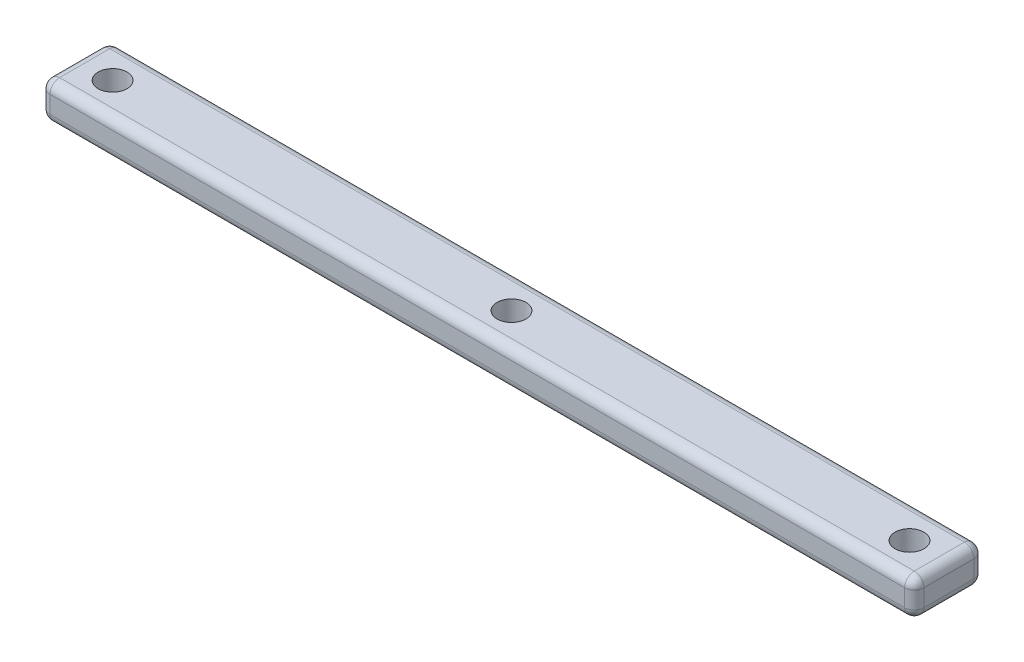
ISO-10303-21;
HEADER;
FILE_DESCRIPTION(('STEP AP214'),'2;1');
FILE_NAME('part.step','',(''),(''),'','','');
FILE_SCHEMA(('AUTOMOTIVE_DESIGN { 1 0 10303 214 1 1 1 1 }'));
ENDSEC;
DATA;
#1=APPLICATION_CONTEXT('core data for automotive mechanical design processes');
#2=APPLICATION_PROTOCOL_DEFINITION('international standard','automotive_design',2000,#1);
#3=PRODUCT_CONTEXT('',#1,'mechanical');
#4=PRODUCT('Part','Part','',(#3));
#5=PRODUCT_RELATED_PRODUCT_CATEGORY('part','',(#4));
#6=PRODUCT_DEFINITION_FORMATION('','',#4);
#7=PRODUCT_DEFINITION_CONTEXT('part definition',#1,'design');
#8=PRODUCT_DEFINITION('design','',#6,#7);
#9=PRODUCT_DEFINITION_SHAPE('','',#8);
#10=(LENGTH_UNIT() NAMED_UNIT(*) SI_UNIT(.MILLI.,.METRE.));
#11=(NAMED_UNIT(*) PLANE_ANGLE_UNIT() SI_UNIT($,.RADIAN.));
#12=(NAMED_UNIT(*) SI_UNIT($,.STERADIAN.) SOLID_ANGLE_UNIT());
#13=UNCERTAINTY_MEASURE_WITH_UNIT(LENGTH_MEASURE(1.E-05),#10,'distance_accuracy_value','');
#14=(GEOMETRIC_REPRESENTATION_CONTEXT(3) GLOBAL_UNCERTAINTY_ASSIGNED_CONTEXT((#13)) GLOBAL_UNIT_ASSIGNED_CONTEXT((#10,
#11,#12)) REPRESENTATION_CONTEXT('',''));
#15=CARTESIAN_POINT('',(0.,0.,0.));
#16=DIRECTION('',(0.,0.,1.));
#17=DIRECTION('',(1.,0.,0.));
#18=AXIS2_PLACEMENT_3D('',#15,#16,#17);
#19=CARTESIAN_POINT('',(0.,3.8,0.));
#20=DIRECTION('',(0.,1.,0.));
#21=DIRECTION('',(0.,0.,1.));
#22=AXIS2_PLACEMENT_3D('',#19,#20,#21);
#23=PLANE('',#22);
#24=DIRECTION('',(0.,0.,1.));
#25=VECTOR('',#24,1.);
#26=CARTESIAN_POINT('',(-44.35,3.8,3.6));
#27=LINE('',#26,#25);
#28=CARTESIAN_POINT('',(-44.35,3.8,-2.6));
#29=VERTEX_POINT('',#28);
#30=CARTESIAN_POINT('',(-44.35,3.8,2.6));
#31=VERTEX_POINT('',#30);
#32=EDGE_CURVE('E191',#29,#31,#27,.T.);
#33=ORIENTED_EDGE('',*,*,#32,.T.);
#34=DIRECTION('',(1.,0.,0.));
#35=VECTOR('',#34,1.);
#36=CARTESIAN_POINT('',(45.35,3.8,2.6));
#37=LINE('',#36,#35);
#38=CARTESIAN_POINT('',(44.35,3.8,2.6));
#39=VERTEX_POINT('',#38);
#40=EDGE_CURVE('E200',#31,#39,#37,.T.);
#41=ORIENTED_EDGE('',*,*,#40,.T.);
#42=DIRECTION('',(0.,0.,-1.));
#43=VECTOR('',#42,1.);
#44=CARTESIAN_POINT('',(44.35,3.8,-3.6));
#45=LINE('',#44,#43);
#46=CARTESIAN_POINT('',(44.35,3.8,-2.6));
#47=VERTEX_POINT('',#46);
#48=EDGE_CURVE('E197',#39,#47,#45,.T.);
#49=ORIENTED_EDGE('',*,*,#48,.T.);
#50=DIRECTION('',(-1.,0.,0.));
#51=VECTOR('',#50,1.);
#52=CARTESIAN_POINT('',(-45.35,3.8,-2.6));
#53=LINE('',#52,#51);
#54=EDGE_CURVE('E194',#47,#29,#53,.T.);
#55=ORIENTED_EDGE('',*,*,#54,.T.);
#56=EDGE_LOOP('',(#33,#41,#49,#55));
#57=FACE_BOUND('',#56,.T.);
#58=CARTESIAN_POINT('',(0.0500000000000014,3.8,0.0999999999999994));
#59=DIRECTION('',(0.,1.,0.));
#60=DIRECTION('',(0.,0.,1.));
#61=AXIS2_PLACEMENT_3D('',#58,#59,#60);
#62=CIRCLE('',#61,1.5);
#63=CARTESIAN_POINT('',(0.0500000000000014,3.8,-1.4));
#64=VERTEX_POINT('',#63);
#65=EDGE_CURVE('E330',#64,#64,#62,.T.);
#66=ORIENTED_EDGE('',*,*,#65,.F.);
#67=EDGE_LOOP('',(#66));
#68=FACE_BOUND('',#67,.T.);
#69=CARTESIAN_POINT('',(-41.35,3.8,0.0999999999999994));
#70=DIRECTION('',(0.,1.,0.));
#71=DIRECTION('',(0.,0.,1.));
#72=AXIS2_PLACEMENT_3D('',#69,#70,#71);
#73=CIRCLE('',#72,1.5);
#74=CARTESIAN_POINT('',(-41.35,3.8,-1.4));
#75=VERTEX_POINT('',#74);
#76=EDGE_CURVE('E168',#75,#75,#73,.T.);
#77=ORIENTED_EDGE('',*,*,#76,.F.);
#78=EDGE_LOOP('',(#77));
#79=FACE_BOUND('',#78,.T.);
#80=CARTESIAN_POINT('',(41.35,3.8,0.0999999999999994));
#81=DIRECTION('',(0.,1.,0.));
#82=DIRECTION('',(0.,0.,1.));
#83=AXIS2_PLACEMENT_3D('',#80,#81,#82);
#84=CIRCLE('',#83,1.5);
#85=CARTESIAN_POINT('',(41.35,3.8,-1.4));
#86=VERTEX_POINT('',#85);
#87=EDGE_CURVE('E321',#86,#86,#84,.T.);
#88=ORIENTED_EDGE('',*,*,#87,.F.);
#89=EDGE_LOOP('',(#88));
#90=FACE_BOUND('',#89,.T.);
#91=ADVANCED_FACE('F45',(#57,#68,#79,#90),#23,.T.);
#92=CARTESIAN_POINT('',(0.,0.,0.));
#93=DIRECTION('',(0.,1.,0.));
#94=DIRECTION('',(0.,0.,1.));
#95=AXIS2_PLACEMENT_3D('',#92,#93,#94);
#96=PLANE('',#95);
#97=DIRECTION('',(0.,0.,-1.));
#98=VECTOR('',#97,1.);
#99=CARTESIAN_POINT('',(44.35,0.,0.));
#100=LINE('',#99,#98);
#101=CARTESIAN_POINT('',(44.35,0.,-2.6));
#102=VERTEX_POINT('',#101);
#103=CARTESIAN_POINT('',(44.35,0.,2.6));
#104=VERTEX_POINT('',#103);
#105=EDGE_CURVE('E223',#102,#104,#100,.F.);
#106=ORIENTED_EDGE('',*,*,#105,.T.);
#107=DIRECTION('',(1.,0.,0.));
#108=VECTOR('',#107,1.);
#109=CARTESIAN_POINT('',(0.,0.,2.6));
#110=LINE('',#109,#108);
#111=CARTESIAN_POINT('',(-44.35,0.,2.6));
#112=VERTEX_POINT('',#111);
#113=EDGE_CURVE('E226',#104,#112,#110,.F.);
#114=ORIENTED_EDGE('',*,*,#113,.T.);
#115=DIRECTION('',(0.,0.,1.));
#116=VECTOR('',#115,1.);
#117=CARTESIAN_POINT('',(-44.35,0.,0.));
#118=LINE('',#117,#116);
#119=CARTESIAN_POINT('',(-44.35,0.,-2.6));
#120=VERTEX_POINT('',#119);
#121=EDGE_CURVE('E217',#112,#120,#118,.F.);
#122=ORIENTED_EDGE('',*,*,#121,.T.);
#123=DIRECTION('',(-1.,0.,0.));
#124=VECTOR('',#123,1.);
#125=CARTESIAN_POINT('',(0.,0.,-2.6));
#126=LINE('',#125,#124);
#127=EDGE_CURVE('E220',#120,#102,#126,.F.);
#128=ORIENTED_EDGE('',*,*,#127,.T.);
#129=EDGE_LOOP('',(#106,#114,#122,#128));
#130=FACE_BOUND('',#129,.T.);
#131=CARTESIAN_POINT('',(-41.35,0.,0.0999999999999994));
#132=DIRECTION('',(0.,1.,0.));
#133=DIRECTION('',(0.,0.,1.));
#134=AXIS2_PLACEMENT_3D('',#131,#132,#133);
#135=CIRCLE('',#134,1.5);
#136=CARTESIAN_POINT('',(-41.35,0.,-1.4));
#137=VERTEX_POINT('',#136);
#138=EDGE_CURVE('E334',#137,#137,#135,.T.);
#139=ORIENTED_EDGE('',*,*,#138,.T.);
#140=EDGE_LOOP('',(#139));
#141=FACE_BOUND('',#140,.T.);
#142=CARTESIAN_POINT('',(0.0500000000000014,0.,0.0999999999999994));
#143=DIRECTION('',(0.,1.,0.));
#144=DIRECTION('',(0.,0.,1.));
#145=AXIS2_PLACEMENT_3D('',#142,#143,#144);
#146=CIRCLE('',#145,1.5);
#147=CARTESIAN_POINT('',(0.0500000000000014,0.,-1.4));
#148=VERTEX_POINT('',#147);
#149=EDGE_CURVE('E327',#148,#148,#146,.T.);
#150=ORIENTED_EDGE('',*,*,#149,.T.);
#151=EDGE_LOOP('',(#150));
#152=FACE_BOUND('',#151,.T.);
#153=CARTESIAN_POINT('',(41.35,0.,0.0999999999999994));
#154=DIRECTION('',(0.,1.,0.));
#155=DIRECTION('',(0.,0.,1.));
#156=AXIS2_PLACEMENT_3D('',#153,#154,#155);
#157=CIRCLE('',#156,1.5);
#158=CARTESIAN_POINT('',(41.35,0.,-1.4));
#159=VERTEX_POINT('',#158);
#160=EDGE_CURVE('E314',#159,#159,#157,.T.);
#161=ORIENTED_EDGE('',*,*,#160,.T.);
#162=EDGE_LOOP('',(#161));
#163=FACE_BOUND('',#162,.T.);
#164=ADVANCED_FACE('F376',(#130,#141,#152,#163),#96,.F.);
#165=CARTESIAN_POINT('',(-45.35,3.8,-3.6));
#166=DIRECTION('',(1.,0.,0.));
#167=DIRECTION('',(0.,0.,-1.));
#168=AXIS2_PLACEMENT_3D('',#165,#166,#167);
#169=PLANE('',#168);
#170=DIRECTION('',(0.,-1.,0.));
#171=VECTOR('',#170,1.);
#172=CARTESIAN_POINT('',(-45.35,3.8,-2.6));
#173=LINE('',#172,#171);
#174=CARTESIAN_POINT('',(-45.35,2.8,-2.6));
#175=VERTEX_POINT('',#174);
#176=CARTESIAN_POINT('',(-45.35,1.,-2.6));
#177=VERTEX_POINT('',#176);
#178=EDGE_CURVE('E179',#175,#177,#173,.T.);
#179=ORIENTED_EDGE('',*,*,#178,.T.);
#180=DIRECTION('',(0.,0.,1.));
#181=VECTOR('',#180,1.);
#182=CARTESIAN_POINT('',(-45.35,1.,-3.6));
#183=LINE('',#182,#181);
#184=CARTESIAN_POINT('',(-45.35,1.,2.6));
#185=VERTEX_POINT('',#184);
#186=EDGE_CURVE('E188',#177,#185,#183,.T.);
#187=ORIENTED_EDGE('',*,*,#186,.T.);
#188=DIRECTION('',(0.,-1.,0.));
#189=VECTOR('',#188,1.);
#190=CARTESIAN_POINT('',(-45.35,3.8,2.6));
#191=LINE('',#190,#189);
#192=CARTESIAN_POINT('',(-45.35,2.8,2.6));
#193=VERTEX_POINT('',#192);
#194=EDGE_CURVE('E142',#185,#193,#191,.F.);
#195=ORIENTED_EDGE('',*,*,#194,.T.);
#196=DIRECTION('',(0.,0.,1.));
#197=VECTOR('',#196,1.);
#198=CARTESIAN_POINT('',(-45.35,2.8,-3.6));
#199=LINE('',#198,#197);
#200=EDGE_CURVE('E175',#193,#175,#199,.F.);
#201=ORIENTED_EDGE('',*,*,#200,.T.);
#202=EDGE_LOOP('',(#179,#187,#195,#201));
#203=FACE_BOUND('',#202,.T.);
#204=ADVANCED_FACE('F368',(#203),#169,.F.);
#205=CARTESIAN_POINT('',(-45.35,3.8,3.6));
#206=DIRECTION('',(0.,0.,-1.));
#207=DIRECTION('',(-1.,0.,0.));
#208=AXIS2_PLACEMENT_3D('',#205,#206,#207);
#209=PLANE('',#208);
#210=DIRECTION('',(1.,0.,0.));
#211=VECTOR('',#210,1.);
#212=CARTESIAN_POINT('',(-45.35,2.8,3.6));
#213=LINE('',#212,#211);
#214=CARTESIAN_POINT('',(44.35,2.8,3.6));
#215=VERTEX_POINT('',#214);
#216=CARTESIAN_POINT('',(-44.35,2.8,3.6));
#217=VERTEX_POINT('',#216);
#218=EDGE_CURVE('E172',#215,#217,#213,.F.);
#219=ORIENTED_EDGE('',*,*,#218,.T.);
#220=DIRECTION('',(0.,-1.,0.));
#221=VECTOR('',#220,1.);
#222=CARTESIAN_POINT('',(-44.35,3.8,3.6));
#223=LINE('',#222,#221);
#224=CARTESIAN_POINT('',(-44.35,1.,3.6));
#225=VERTEX_POINT('',#224);
#226=EDGE_CURVE('E140',#217,#225,#223,.T.);
#227=ORIENTED_EDGE('',*,*,#226,.T.);
#228=DIRECTION('',(1.,0.,0.));
#229=VECTOR('',#228,1.);
#230=CARTESIAN_POINT('',(-45.35,1.,3.6));
#231=LINE('',#230,#229);
#232=CARTESIAN_POINT('',(44.35,1.,3.6));
#233=VERTEX_POINT('',#232);
#234=EDGE_CURVE('E160',#225,#233,#231,.T.);
#235=ORIENTED_EDGE('',*,*,#234,.T.);
#236=DIRECTION('',(0.,-1.,0.));
#237=VECTOR('',#236,1.);
#238=CARTESIAN_POINT('',(44.35,3.8,3.6));
#239=LINE('',#238,#237);
#240=EDGE_CURVE('E167',#233,#215,#239,.F.);
#241=ORIENTED_EDGE('',*,*,#240,.T.);
#242=EDGE_LOOP('',(#219,#227,#235,#241));
#243=FACE_BOUND('',#242,.T.);
#244=ADVANCED_FACE('F170',(#243),#209,.F.);
#245=CARTESIAN_POINT('',(45.35,3.8,-3.6));
#246=DIRECTION('',(-1.,0.,0.));
#247=DIRECTION('',(0.,0.,1.));
#248=AXIS2_PLACEMENT_3D('',#245,#246,#247);
#249=PLANE('',#248);
#250=DIRECTION('',(0.,-1.,0.));
#251=VECTOR('',#250,1.);
#252=CARTESIAN_POINT('',(45.35,3.8,2.6));
#253=LINE('',#252,#251);
#254=CARTESIAN_POINT('',(45.35,2.8,2.6));
#255=VERTEX_POINT('',#254);
#256=CARTESIAN_POINT('',(45.35,1.,2.6));
#257=VERTEX_POINT('',#256);
#258=EDGE_CURVE('E210',#255,#257,#253,.T.);
#259=ORIENTED_EDGE('',*,*,#258,.T.);
#260=DIRECTION('',(0.,0.,-1.));
#261=VECTOR('',#260,1.);
#262=CARTESIAN_POINT('',(45.35,1.,-3.6));
#263=LINE('',#262,#261);
#264=CARTESIAN_POINT('',(45.35,1.,-2.6));
#265=VERTEX_POINT('',#264);
#266=EDGE_CURVE('E214',#257,#265,#263,.T.);
#267=ORIENTED_EDGE('',*,*,#266,.T.);
#268=DIRECTION('',(0.,-1.,0.));
#269=VECTOR('',#268,1.);
#270=CARTESIAN_POINT('',(45.35,3.8,-2.6));
#271=LINE('',#270,#269);
#272=CARTESIAN_POINT('',(45.35,2.8,-2.6));
#273=VERTEX_POINT('',#272);
#274=EDGE_CURVE('E207',#265,#273,#271,.F.);
#275=ORIENTED_EDGE('',*,*,#274,.T.);
#276=DIRECTION('',(0.,0.,-1.));
#277=VECTOR('',#276,1.);
#278=CARTESIAN_POINT('',(45.35,2.8,3.6));
#279=LINE('',#278,#277);
#280=EDGE_CURVE('E204',#273,#255,#279,.F.);
#281=ORIENTED_EDGE('',*,*,#280,.T.);
#282=EDGE_LOOP('',(#259,#267,#275,#281));
#283=FACE_BOUND('',#282,.T.);
#284=ADVANCED_FACE('F412',(#283),#249,.F.);
#285=CARTESIAN_POINT('',(-45.35,3.8,-3.6));
#286=DIRECTION('',(0.,0.,1.));
#287=DIRECTION('',(1.,0.,0.));
#288=AXIS2_PLACEMENT_3D('',#285,#286,#287);
#289=PLANE('',#288);
#290=DIRECTION('',(0.,-1.,0.));
#291=VECTOR('',#290,1.);
#292=CARTESIAN_POINT('',(44.35,3.8,-3.6));
#293=LINE('',#292,#291);
#294=CARTESIAN_POINT('',(44.35,2.8,-3.6));
#295=VERTEX_POINT('',#294);
#296=CARTESIAN_POINT('',(44.35,1.,-3.6));
#297=VERTEX_POINT('',#296);
#298=EDGE_CURVE('E66',#295,#297,#293,.T.);
#299=ORIENTED_EDGE('',*,*,#298,.T.);
#300=DIRECTION('',(-1.,0.,0.));
#301=VECTOR('',#300,1.);
#302=CARTESIAN_POINT('',(-45.35,1.,-3.6));
#303=LINE('',#302,#301);
#304=CARTESIAN_POINT('',(-44.35,1.,-3.6));
#305=VERTEX_POINT('',#304);
#306=EDGE_CURVE('E11',#297,#305,#303,.T.);
#307=ORIENTED_EDGE('',*,*,#306,.T.);
#308=DIRECTION('',(0.,-1.,0.));
#309=VECTOR('',#308,1.);
#310=CARTESIAN_POINT('',(-44.35,3.8,-3.6));
#311=LINE('',#310,#309);
#312=CARTESIAN_POINT('',(-44.35,2.8,-3.6));
#313=VERTEX_POINT('',#312);
#314=EDGE_CURVE('E55',#305,#313,#311,.F.);
#315=ORIENTED_EDGE('',*,*,#314,.T.);
#316=DIRECTION('',(-1.,0.,0.));
#317=VECTOR('',#316,1.);
#318=CARTESIAN_POINT('',(45.35,2.8,-3.6));
#319=LINE('',#318,#317);
#320=EDGE_CURVE('E230',#313,#295,#319,.F.);
#321=ORIENTED_EDGE('',*,*,#320,.T.);
#322=EDGE_LOOP('',(#299,#307,#315,#321));
#323=FACE_BOUND('',#322,.T.);
#324=ADVANCED_FACE('F409',(#323),#289,.F.);
#325=CARTESIAN_POINT('',(-41.35,3.8,0.0999999999999994));
#326=DIRECTION('',(0.,-1.,0.));
#327=DIRECTION('',(0.,0.,-1.));
#328=AXIS2_PLACEMENT_3D('',#325,#326,#327);
#329=CYLINDRICAL_SURFACE('',#328,1.5);
#330=CARTESIAN_POINT('',(-41.35,3.8,-1.4));
#331=CARTESIAN_POINT('',(-41.35,3.76041666666667,-1.4));
#332=CARTESIAN_POINT('',(-41.35,3.72083333333333,-1.4));
#333=CARTESIAN_POINT('',(-41.35,3.64166666666667,-1.4));
#334=CARTESIAN_POINT('',(-41.35,3.60208333333333,-1.4));
#335=CARTESIAN_POINT('',(-41.35,3.52291666666667,-1.4));
#336=CARTESIAN_POINT('',(-41.35,3.48333333333333,-1.4));
#337=CARTESIAN_POINT('',(-41.35,3.40416666666667,-1.4));
#338=CARTESIAN_POINT('',(-41.35,3.36458333333333,-1.4));
#339=CARTESIAN_POINT('',(-41.35,3.28541666666667,-1.4));
#340=CARTESIAN_POINT('',(-41.35,3.24583333333333,-1.4));
#341=CARTESIAN_POINT('',(-41.35,3.16666666666667,-1.4));
#342=CARTESIAN_POINT('',(-41.35,3.12708333333333,-1.4));
#343=CARTESIAN_POINT('',(-41.35,3.04791666666667,-1.4));
#344=CARTESIAN_POINT('',(-41.35,3.00833333333333,-1.4));
#345=CARTESIAN_POINT('',(-41.35,2.92916666666667,-1.4));
#346=CARTESIAN_POINT('',(-41.35,2.88958333333333,-1.4));
#347=CARTESIAN_POINT('',(-41.35,2.81041666666667,-1.4));
#348=CARTESIAN_POINT('',(-41.35,2.77083333333333,-1.4));
#349=CARTESIAN_POINT('',(-41.35,2.69166666666667,-1.4));
#350=CARTESIAN_POINT('',(-41.35,2.65208333333333,-1.4));
#351=CARTESIAN_POINT('',(-41.35,2.57291666666667,-1.4));
#352=CARTESIAN_POINT('',(-41.35,2.53333333333333,-1.4));
#353=CARTESIAN_POINT('',(-41.35,2.45416666666667,-1.4));
#354=CARTESIAN_POINT('',(-41.35,2.41458333333333,-1.4));
#355=CARTESIAN_POINT('',(-41.35,2.33541666666667,-1.4));
#356=CARTESIAN_POINT('',(-41.35,2.29583333333333,-1.4));
#357=CARTESIAN_POINT('',(-41.35,2.21666666666667,-1.4));
#358=CARTESIAN_POINT('',(-41.35,2.17708333333333,-1.4));
#359=CARTESIAN_POINT('',(-41.35,2.09791666666667,-1.4));
#360=CARTESIAN_POINT('',(-41.35,2.05833333333333,-1.4));
#361=CARTESIAN_POINT('',(-41.35,1.97916666666667,-1.4));
#362=CARTESIAN_POINT('',(-41.35,1.93958333333333,-1.4));
#363=CARTESIAN_POINT('',(-41.35,1.86041666666667,-1.4));
#364=CARTESIAN_POINT('',(-41.35,1.82083333333333,-1.4));
#365=CARTESIAN_POINT('',(-41.35,1.74166666666667,-1.4));
#366=CARTESIAN_POINT('',(-41.35,1.70208333333333,-1.4));
#367=CARTESIAN_POINT('',(-41.35,1.62291666666667,-1.4));
#368=CARTESIAN_POINT('',(-41.35,1.58333333333333,-1.4));
#369=CARTESIAN_POINT('',(-41.35,1.50416666666667,-1.4));
#370=CARTESIAN_POINT('',(-41.35,1.46458333333333,-1.4));
#371=CARTESIAN_POINT('',(-41.35,1.38541666666667,-1.4));
#372=CARTESIAN_POINT('',(-41.35,1.34583333333333,-1.4));
#373=CARTESIAN_POINT('',(-41.35,1.26666666666667,-1.4));
#374=CARTESIAN_POINT('',(-41.35,1.22708333333333,-1.4));
#375=CARTESIAN_POINT('',(-41.35,1.14791666666667,-1.4));
#376=CARTESIAN_POINT('',(-41.35,1.10833333333333,-1.4));
#377=CARTESIAN_POINT('',(-41.35,1.02916666666667,-1.4));
#378=CARTESIAN_POINT('',(-41.35,0.989583333333333,-1.4));
#379=CARTESIAN_POINT('',(-41.35,0.910416666666667,-1.4));
#380=CARTESIAN_POINT('',(-41.35,0.870833333333333,-1.4));
#381=CARTESIAN_POINT('',(-41.35,0.791666666666667,-1.4));
#382=CARTESIAN_POINT('',(-41.35,0.752083333333333,-1.4));
#383=CARTESIAN_POINT('',(-41.35,0.672916666666667,-1.4));
#384=CARTESIAN_POINT('',(-41.35,0.633333333333333,-1.4));
#385=CARTESIAN_POINT('',(-41.35,0.554166666666667,-1.4));
#386=CARTESIAN_POINT('',(-41.35,0.514583333333334,-1.4));
#387=CARTESIAN_POINT('',(-41.35,0.435416666666667,-1.4));
#388=CARTESIAN_POINT('',(-41.35,0.395833333333333,-1.4));
#389=CARTESIAN_POINT('',(-41.35,0.316666666666666,-1.4));
#390=CARTESIAN_POINT('',(-41.35,0.277083333333333,-1.4));
#391=CARTESIAN_POINT('',(-41.35,0.197916666666667,-1.4));
#392=CARTESIAN_POINT('',(-41.35,0.158333333333333,-1.4));
#393=CARTESIAN_POINT('',(-41.35,0.0791666666666666,-1.4));
#394=CARTESIAN_POINT('',(-41.35,0.0395833333333333,-1.4));
#395=CARTESIAN_POINT('',(-41.35,0.,-1.4));
#396=B_SPLINE_CURVE_WITH_KNOTS('',3,(#330,#331,#332,#333,#334,#335,#336,#337,#338,#339,#340,
#341,#342,#343,#344,#345,#346,#347,#348,#349,#350,#351,#352,#353,#354,#355,#356,#357,#358,#359,
#360,#361,#362,#363,#364,#365,#366,#367,#368,#369,#370,#371,#372,#373,#374,#375,#376,#377,#378,
#379,#380,#381,#382,#383,#384,#385,#386,#387,#388,#389,#390,#391,#392,#393,#394,#395),
.UNSPECIFIED.,.F.,.F.,(4,2,2,2,2,2,2,2,2,2,2,2,2,2,2,2,2,2,2,2,2,2,2,2,2,2,2,2,2,2,2,2,4),(0.,
0.11875,0.2375,0.35625,0.475,0.59375,0.7125,0.831249999999999,0.95,1.06875,1.1875,1.30625,1.425,
1.54375,1.6625,1.78125,1.9,2.01875,2.1375,2.25625,2.375,2.49375,2.6125,2.73125,2.85,2.96875,
3.0875,3.20625,3.325,3.44375,3.5625,3.68125,3.8),.UNSPECIFIED.);
#397=EDGE_CURVE('BSEAM406',#75,#137,#396,.T.);
#398=ORIENTED_EDGE('',*,*,#76,.T.);
#399=ORIENTED_EDGE('',*,*,#138,.F.);
#400=ORIENTED_EDGE('',*,*,#397,.T.);
#401=ORIENTED_EDGE('',*,*,#397,.F.);
#402=EDGE_LOOP('',(#398,#400,#399,#401));
#403=FACE_BOUND('',#402,.T.);
#404=ADVANCED_FACE('F406',(#403),#329,.F.);
#405=CARTESIAN_POINT('',(0.0500000000000014,3.8,0.0999999999999994));
#406=DIRECTION('',(0.,-1.,0.));
#407=DIRECTION('',(0.,0.,-1.));
#408=AXIS2_PLACEMENT_3D('',#405,#406,#407);
#409=CYLINDRICAL_SURFACE('',#408,1.5);
#410=CARTESIAN_POINT('',(0.0500000000000014,3.8,-1.4));
#411=CARTESIAN_POINT('',(0.0500000000000014,3.76041666666667,-1.4));
#412=CARTESIAN_POINT('',(0.0500000000000014,3.72083333333333,-1.4));
#413=CARTESIAN_POINT('',(0.0500000000000014,3.64166666666667,-1.4));
#414=CARTESIAN_POINT('',(0.0500000000000014,3.60208333333333,-1.4));
#415=CARTESIAN_POINT('',(0.0500000000000014,3.52291666666667,-1.4));
#416=CARTESIAN_POINT('',(0.0500000000000014,3.48333333333333,-1.4));
#417=CARTESIAN_POINT('',(0.0500000000000014,3.40416666666667,-1.4));
#418=CARTESIAN_POINT('',(0.0500000000000014,3.36458333333333,-1.4));
#419=CARTESIAN_POINT('',(0.0500000000000014,3.28541666666667,-1.4));
#420=CARTESIAN_POINT('',(0.0500000000000014,3.24583333333333,-1.4));
#421=CARTESIAN_POINT('',(0.0500000000000014,3.16666666666667,-1.4));
#422=CARTESIAN_POINT('',(0.0500000000000014,3.12708333333333,-1.4));
#423=CARTESIAN_POINT('',(0.0500000000000014,3.04791666666667,-1.4));
#424=CARTESIAN_POINT('',(0.0500000000000014,3.00833333333333,-1.4));
#425=CARTESIAN_POINT('',(0.0500000000000014,2.92916666666667,-1.4));
#426=CARTESIAN_POINT('',(0.0500000000000014,2.88958333333333,-1.4));
#427=CARTESIAN_POINT('',(0.0500000000000014,2.81041666666667,-1.4));
#428=CARTESIAN_POINT('',(0.0500000000000014,2.77083333333333,-1.4));
#429=CARTESIAN_POINT('',(0.0500000000000014,2.69166666666667,-1.4));
#430=CARTESIAN_POINT('',(0.0500000000000014,2.65208333333333,-1.4));
#431=CARTESIAN_POINT('',(0.0500000000000014,2.57291666666667,-1.4));
#432=CARTESIAN_POINT('',(0.0500000000000014,2.53333333333333,-1.4));
#433=CARTESIAN_POINT('',(0.0500000000000014,2.45416666666667,-1.4));
#434=CARTESIAN_POINT('',(0.0500000000000014,2.41458333333333,-1.4));
#435=CARTESIAN_POINT('',(0.0500000000000014,2.33541666666667,-1.4));
#436=CARTESIAN_POINT('',(0.0500000000000014,2.29583333333333,-1.4));
#437=CARTESIAN_POINT('',(0.0500000000000014,2.21666666666667,-1.4));
#438=CARTESIAN_POINT('',(0.0500000000000014,2.17708333333333,-1.4));
#439=CARTESIAN_POINT('',(0.0500000000000014,2.09791666666667,-1.4));
#440=CARTESIAN_POINT('',(0.0500000000000014,2.05833333333333,-1.4));
#441=CARTESIAN_POINT('',(0.0500000000000014,1.97916666666667,-1.4));
#442=CARTESIAN_POINT('',(0.0500000000000014,1.93958333333333,-1.4));
#443=CARTESIAN_POINT('',(0.0500000000000014,1.86041666666667,-1.4));
#444=CARTESIAN_POINT('',(0.0500000000000014,1.82083333333333,-1.4));
#445=CARTESIAN_POINT('',(0.0500000000000014,1.74166666666667,-1.4));
#446=CARTESIAN_POINT('',(0.0500000000000014,1.70208333333333,-1.4));
#447=CARTESIAN_POINT('',(0.0500000000000014,1.62291666666667,-1.4));
#448=CARTESIAN_POINT('',(0.0500000000000014,1.58333333333333,-1.4));
#449=CARTESIAN_POINT('',(0.0500000000000014,1.50416666666667,-1.4));
#450=CARTESIAN_POINT('',(0.0500000000000014,1.46458333333333,-1.4));
#451=CARTESIAN_POINT('',(0.0500000000000014,1.38541666666667,-1.4));
#452=CARTESIAN_POINT('',(0.0500000000000014,1.34583333333333,-1.4));
#453=CARTESIAN_POINT('',(0.0500000000000014,1.26666666666667,-1.4));
#454=CARTESIAN_POINT('',(0.0500000000000014,1.22708333333333,-1.4));
#455=CARTESIAN_POINT('',(0.0500000000000014,1.14791666666667,-1.4));
#456=CARTESIAN_POINT('',(0.0500000000000014,1.10833333333333,-1.4));
#457=CARTESIAN_POINT('',(0.0500000000000014,1.02916666666667,-1.4));
#458=CARTESIAN_POINT('',(0.0500000000000014,0.989583333333333,-1.4));
#459=CARTESIAN_POINT('',(0.0500000000000014,0.910416666666667,-1.4));
#460=CARTESIAN_POINT('',(0.0500000000000014,0.870833333333333,-1.4));
#461=CARTESIAN_POINT('',(0.0500000000000014,0.791666666666667,-1.4));
#462=CARTESIAN_POINT('',(0.0500000000000014,0.752083333333333,-1.4));
#463=CARTESIAN_POINT('',(0.0500000000000014,0.672916666666667,-1.4));
#464=CARTESIAN_POINT('',(0.0500000000000014,0.633333333333333,-1.4));
#465=CARTESIAN_POINT('',(0.0500000000000014,0.554166666666667,-1.4));
#466=CARTESIAN_POINT('',(0.0500000000000014,0.514583333333334,-1.4));
#467=CARTESIAN_POINT('',(0.0500000000000014,0.435416666666667,-1.4));
#468=CARTESIAN_POINT('',(0.0500000000000014,0.395833333333333,-1.4));
#469=CARTESIAN_POINT('',(0.0500000000000014,0.316666666666666,-1.4));
#470=CARTESIAN_POINT('',(0.0500000000000014,0.277083333333333,-1.4));
#471=CARTESIAN_POINT('',(0.0500000000000014,0.197916666666667,-1.4));
#472=CARTESIAN_POINT('',(0.0500000000000014,0.158333333333333,-1.4));
#473=CARTESIAN_POINT('',(0.0500000000000014,0.0791666666666666,-1.4));
#474=CARTESIAN_POINT('',(0.0500000000000014,0.0395833333333333,-1.4));
#475=CARTESIAN_POINT('',(0.0500000000000014,0.,-1.4));
#476=B_SPLINE_CURVE_WITH_KNOTS('',3,(#410,#411,#412,#413,#414,#415,#416,#417,#418,#419,#420,
#421,#422,#423,#424,#425,#426,#427,#428,#429,#430,#431,#432,#433,#434,#435,#436,#437,#438,#439,
#440,#441,#442,#443,#444,#445,#446,#447,#448,#449,#450,#451,#452,#453,#454,#455,#456,#457,#458,
#459,#460,#461,#462,#463,#464,#465,#466,#467,#468,#469,#470,#471,#472,#473,#474,#475),
.UNSPECIFIED.,.F.,.F.,(4,2,2,2,2,2,2,2,2,2,2,2,2,2,2,2,2,2,2,2,2,2,2,2,2,2,2,2,2,2,2,2,4),(0.,
0.11875,0.2375,0.35625,0.475,0.59375,0.7125,0.831249999999999,0.95,1.06875,1.1875,1.30625,1.425,
1.54375,1.6625,1.78125,1.9,2.01875,2.1375,2.25625,2.375,2.49375,2.6125,2.73125,2.85,2.96875,
3.0875,3.20625,3.325,3.44375,3.5625,3.68125,3.8),.UNSPECIFIED.);
#477=EDGE_CURVE('BSEAM575',#64,#148,#476,.T.);
#478=ORIENTED_EDGE('',*,*,#65,.T.);
#479=ORIENTED_EDGE('',*,*,#149,.F.);
#480=ORIENTED_EDGE('',*,*,#477,.T.);
#481=ORIENTED_EDGE('',*,*,#477,.F.);
#482=EDGE_LOOP('',(#478,#480,#479,#481));
#483=FACE_BOUND('',#482,.T.);
#484=ADVANCED_FACE('F575',(#483),#409,.F.);
#485=CARTESIAN_POINT('',(41.35,3.8,0.0999999999999994));
#486=DIRECTION('',(0.,-1.,0.));
#487=DIRECTION('',(0.,0.,-1.));
#488=AXIS2_PLACEMENT_3D('',#485,#486,#487);
#489=CYLINDRICAL_SURFACE('',#488,1.5);
#490=CARTESIAN_POINT('',(41.35,3.8,-1.4));
#491=CARTESIAN_POINT('',(41.35,3.76041666666667,-1.4));
#492=CARTESIAN_POINT('',(41.35,3.72083333333333,-1.4));
#493=CARTESIAN_POINT('',(41.35,3.64166666666667,-1.4));
#494=CARTESIAN_POINT('',(41.35,3.60208333333333,-1.4));
#495=CARTESIAN_POINT('',(41.35,3.52291666666667,-1.4));
#496=CARTESIAN_POINT('',(41.35,3.48333333333333,-1.4));
#497=CARTESIAN_POINT('',(41.35,3.40416666666667,-1.4));
#498=CARTESIAN_POINT('',(41.35,3.36458333333333,-1.4));
#499=CARTESIAN_POINT('',(41.35,3.28541666666667,-1.4));
#500=CARTESIAN_POINT('',(41.35,3.24583333333333,-1.4));
#501=CARTESIAN_POINT('',(41.35,3.16666666666667,-1.4));
#502=CARTESIAN_POINT('',(41.35,3.12708333333333,-1.4));
#503=CARTESIAN_POINT('',(41.35,3.04791666666667,-1.4));
#504=CARTESIAN_POINT('',(41.35,3.00833333333333,-1.4));
#505=CARTESIAN_POINT('',(41.35,2.92916666666667,-1.4));
#506=CARTESIAN_POINT('',(41.35,2.88958333333333,-1.4));
#507=CARTESIAN_POINT('',(41.35,2.81041666666667,-1.4));
#508=CARTESIAN_POINT('',(41.35,2.77083333333333,-1.4));
#509=CARTESIAN_POINT('',(41.35,2.69166666666667,-1.4));
#510=CARTESIAN_POINT('',(41.35,2.65208333333333,-1.4));
#511=CARTESIAN_POINT('',(41.35,2.57291666666667,-1.4));
#512=CARTESIAN_POINT('',(41.35,2.53333333333333,-1.4));
#513=CARTESIAN_POINT('',(41.35,2.45416666666667,-1.4));
#514=CARTESIAN_POINT('',(41.35,2.41458333333333,-1.4));
#515=CARTESIAN_POINT('',(41.35,2.33541666666667,-1.4));
#516=CARTESIAN_POINT('',(41.35,2.29583333333333,-1.4));
#517=CARTESIAN_POINT('',(41.35,2.21666666666667,-1.4));
#518=CARTESIAN_POINT('',(41.35,2.17708333333333,-1.4));
#519=CARTESIAN_POINT('',(41.35,2.09791666666667,-1.4));
#520=CARTESIAN_POINT('',(41.35,2.05833333333333,-1.4));
#521=CARTESIAN_POINT('',(41.35,1.97916666666667,-1.4));
#522=CARTESIAN_POINT('',(41.35,1.93958333333333,-1.4));
#523=CARTESIAN_POINT('',(41.35,1.86041666666667,-1.4));
#524=CARTESIAN_POINT('',(41.35,1.82083333333333,-1.4));
#525=CARTESIAN_POINT('',(41.35,1.74166666666667,-1.4));
#526=CARTESIAN_POINT('',(41.35,1.70208333333333,-1.4));
#527=CARTESIAN_POINT('',(41.35,1.62291666666667,-1.4));
#528=CARTESIAN_POINT('',(41.35,1.58333333333333,-1.4));
#529=CARTESIAN_POINT('',(41.35,1.50416666666667,-1.4));
#530=CARTESIAN_POINT('',(41.35,1.46458333333333,-1.4));
#531=CARTESIAN_POINT('',(41.35,1.38541666666667,-1.4));
#532=CARTESIAN_POINT('',(41.35,1.34583333333333,-1.4));
#533=CARTESIAN_POINT('',(41.35,1.26666666666667,-1.4));
#534=CARTESIAN_POINT('',(41.35,1.22708333333333,-1.4));
#535=CARTESIAN_POINT('',(41.35,1.14791666666667,-1.4));
#536=CARTESIAN_POINT('',(41.35,1.10833333333333,-1.4));
#537=CARTESIAN_POINT('',(41.35,1.02916666666667,-1.4));
#538=CARTESIAN_POINT('',(41.35,0.989583333333333,-1.4));
#539=CARTESIAN_POINT('',(41.35,0.910416666666667,-1.4));
#540=CARTESIAN_POINT('',(41.35,0.870833333333333,-1.4));
#541=CARTESIAN_POINT('',(41.35,0.791666666666667,-1.4));
#542=CARTESIAN_POINT('',(41.35,0.752083333333333,-1.4));
#543=CARTESIAN_POINT('',(41.35,0.672916666666667,-1.4));
#544=CARTESIAN_POINT('',(41.35,0.633333333333333,-1.4));
#545=CARTESIAN_POINT('',(41.35,0.554166666666667,-1.4));
#546=CARTESIAN_POINT('',(41.35,0.514583333333334,-1.4));
#547=CARTESIAN_POINT('',(41.35,0.435416666666667,-1.4));
#548=CARTESIAN_POINT('',(41.35,0.395833333333333,-1.4));
#549=CARTESIAN_POINT('',(41.35,0.316666666666666,-1.4));
#550=CARTESIAN_POINT('',(41.35,0.277083333333333,-1.4));
#551=CARTESIAN_POINT('',(41.35,0.197916666666667,-1.4));
#552=CARTESIAN_POINT('',(41.35,0.158333333333333,-1.4));
#553=CARTESIAN_POINT('',(41.35,0.0791666666666666,-1.4));
#554=CARTESIAN_POINT('',(41.35,0.0395833333333333,-1.4));
#555=CARTESIAN_POINT('',(41.35,0.,-1.4));
#556=B_SPLINE_CURVE_WITH_KNOTS('',3,(#490,#491,#492,#493,#494,#495,#496,#497,#498,#499,#500,
#501,#502,#503,#504,#505,#506,#507,#508,#509,#510,#511,#512,#513,#514,#515,#516,#517,#518,#519,
#520,#521,#522,#523,#524,#525,#526,#527,#528,#529,#530,#531,#532,#533,#534,#535,#536,#537,#538,
#539,#540,#541,#542,#543,#544,#545,#546,#547,#548,#549,#550,#551,#552,#553,#554,#555),
.UNSPECIFIED.,.F.,.F.,(4,2,2,2,2,2,2,2,2,2,2,2,2,2,2,2,2,2,2,2,2,2,2,2,2,2,2,2,2,2,2,2,4),(0.,
0.11875,0.2375,0.35625,0.475,0.59375,0.7125,0.831249999999999,0.95,1.06875,1.1875,1.30625,1.425,
1.54375,1.6625,1.78125,1.9,2.01875,2.1375,2.25625,2.375,2.49375,2.6125,2.73125,2.85,2.96875,
3.0875,3.20625,3.325,3.44375,3.5625,3.68125,3.8),.UNSPECIFIED.);
#557=EDGE_CURVE('BSEAM568',#86,#159,#556,.T.);
#558=ORIENTED_EDGE('',*,*,#87,.T.);
#559=ORIENTED_EDGE('',*,*,#160,.F.);
#560=ORIENTED_EDGE('',*,*,#557,.T.);
#561=ORIENTED_EDGE('',*,*,#557,.F.);
#562=EDGE_LOOP('',(#558,#560,#559,#561));
#563=FACE_BOUND('',#562,.T.);
#564=ADVANCED_FACE('F568',(#563),#489,.F.);
#565=CARTESIAN_POINT('',(44.35,3.8,-2.6));
#566=DIRECTION('',(0.,-1.,0.));
#567=DIRECTION('',(0.,0.,-1.));
#568=AXIS2_PLACEMENT_3D('',#565,#566,#567);
#569=CYLINDRICAL_SURFACE('',#568,1.);
#570=CARTESIAN_POINT('',(44.35,2.8,-2.6));
#571=DIRECTION('',(0.,1.,0.));
#572=DIRECTION('',(0.,0.,1.));
#573=AXIS2_PLACEMENT_3D('',#570,#571,#572);
#574=CIRCLE('',#573,1.);
#575=EDGE_CURVE('E49',#273,#295,#574,.T.);
#576=ORIENTED_EDGE('',*,*,#575,.F.);
#577=ORIENTED_EDGE('',*,*,#274,.F.);
#578=CARTESIAN_POINT('',(44.35,1.,-2.6));
#579=DIRECTION('',(0.,-1.,0.));
#580=DIRECTION('',(0.,0.,-1.));
#581=AXIS2_PLACEMENT_3D('',#578,#579,#580);
#582=CIRCLE('',#581,1.);
#583=EDGE_CURVE('E306',#297,#265,#582,.T.);
#584=ORIENTED_EDGE('',*,*,#583,.F.);
#585=ORIENTED_EDGE('',*,*,#298,.F.);
#586=EDGE_LOOP('',(#576,#577,#584,#585));
#587=FACE_BOUND('',#586,.T.);
#588=ADVANCED_FACE('F47',(#587),#569,.T.);
#589=CARTESIAN_POINT('',(44.35,2.8,-2.6));
#590=DIRECTION('',(0.,0.,-1.));
#591=DIRECTION('',(-1.,0.,0.));
#592=AXIS2_PLACEMENT_3D('',#589,#590,#591);
#593=SPHERICAL_SURFACE('',#592,1.);
#594=CARTESIAN_POINT('',(44.35,2.8,-2.6));
#595=DIRECTION('',(0.,0.,-1.));
#596=DIRECTION('',(-1.,0.,0.));
#597=AXIS2_PLACEMENT_3D('',#594,#595,#596);
#598=CIRCLE('',#597,1.);
#599=EDGE_CURVE('E299',#273,#47,#598,.F.);
#600=ORIENTED_EDGE('',*,*,#599,.F.);
#601=ORIENTED_EDGE('',*,*,#575,.T.);
#602=CARTESIAN_POINT('',(44.35,2.8,-2.6));
#603=DIRECTION('',(1.,0.,0.));
#604=DIRECTION('',(0.,1.,0.));
#605=AXIS2_PLACEMENT_3D('',#602,#603,#604);
#606=CIRCLE('',#605,1.);
#607=EDGE_CURVE('E303',#47,#295,#606,.F.);
#608=ORIENTED_EDGE('',*,*,#607,.F.);
#609=EDGE_LOOP('',(#600,#601,#608));
#610=FACE_BOUND('',#609,.T.);
#611=ADVANCED_FACE('F554',(#610),#593,.T.);
#612=CARTESIAN_POINT('',(44.35,1.,-2.6));
#613=DIRECTION('',(1.,0.,0.));
#614=DIRECTION('',(0.,0.,-1.));
#615=AXIS2_PLACEMENT_3D('',#612,#613,#614);
#616=SPHERICAL_SURFACE('',#615,1.);
#617=CARTESIAN_POINT('',(44.35,1.,-2.6));
#618=DIRECTION('',(1.,0.,0.));
#619=DIRECTION('',(0.,0.,-1.));
#620=AXIS2_PLACEMENT_3D('',#617,#618,#619);
#621=CIRCLE('',#620,1.);
#622=EDGE_CURVE('E291',#297,#102,#621,.F.);
#623=ORIENTED_EDGE('',*,*,#622,.F.);
#624=ORIENTED_EDGE('',*,*,#583,.T.);
#625=CARTESIAN_POINT('',(44.35,1.,-2.6));
#626=DIRECTION('',(0.,0.,-1.));
#627=DIRECTION('',(-1.,0.,0.));
#628=AXIS2_PLACEMENT_3D('',#625,#626,#627);
#629=CIRCLE('',#628,1.);
#630=EDGE_CURVE('E295',#102,#265,#629,.F.);
#631=ORIENTED_EDGE('',*,*,#630,.F.);
#632=EDGE_LOOP('',(#623,#624,#631));
#633=FACE_BOUND('',#632,.T.);
#634=ADVANCED_FACE('F545',(#633),#616,.T.);
#635=CARTESIAN_POINT('',(0.,2.8,-2.6));
#636=DIRECTION('',(1.,0.,0.));
#637=DIRECTION('',(0.,0.,-1.));
#638=AXIS2_PLACEMENT_3D('',#635,#636,#637);
#639=CYLINDRICAL_SURFACE('',#638,1.);
#640=ORIENTED_EDGE('',*,*,#607,.T.);
#641=ORIENTED_EDGE('',*,*,#320,.F.);
#642=CARTESIAN_POINT('',(-44.35,2.8,-2.6));
#643=DIRECTION('',(-1.,0.,0.));
#644=DIRECTION('',(0.,0.,1.));
#645=AXIS2_PLACEMENT_3D('',#642,#643,#644);
#646=CIRCLE('',#645,1.);
#647=EDGE_CURVE('E284',#29,#313,#646,.T.);
#648=ORIENTED_EDGE('',*,*,#647,.F.);
#649=ORIENTED_EDGE('',*,*,#54,.F.);
#650=EDGE_LOOP('',(#640,#641,#648,#649));
#651=FACE_BOUND('',#650,.T.);
#652=ADVANCED_FACE('F536',(#651),#639,.T.);
#653=CARTESIAN_POINT('',(44.35,2.8,0.));
#654=DIRECTION('',(0.,0.,1.));
#655=DIRECTION('',(1.,0.,0.));
#656=AXIS2_PLACEMENT_3D('',#653,#654,#655);
#657=CYLINDRICAL_SURFACE('',#656,1.);
#658=ORIENTED_EDGE('',*,*,#599,.T.);
#659=ORIENTED_EDGE('',*,*,#48,.F.);
#660=CARTESIAN_POINT('',(44.35,2.8,2.6));
#661=DIRECTION('',(0.,0.,1.));
#662=DIRECTION('',(1.,0.,0.));
#663=AXIS2_PLACEMENT_3D('',#660,#661,#662);
#664=CIRCLE('',#663,1.);
#665=EDGE_CURVE('E280',#255,#39,#664,.T.);
#666=ORIENTED_EDGE('',*,*,#665,.F.);
#667=ORIENTED_EDGE('',*,*,#280,.F.);
#668=EDGE_LOOP('',(#658,#659,#666,#667));
#669=FACE_BOUND('',#668,.T.);
#670=ADVANCED_FACE('F528',(#669),#657,.T.);
#671=CARTESIAN_POINT('',(44.35,3.8,2.6));
#672=DIRECTION('',(0.,-1.,0.));
#673=DIRECTION('',(0.,0.,-1.));
#674=AXIS2_PLACEMENT_3D('',#671,#672,#673);
#675=CYLINDRICAL_SURFACE('',#674,1.);
#676=CARTESIAN_POINT('',(44.35,1.,2.6));
#677=DIRECTION('',(0.,-1.,0.));
#678=DIRECTION('',(0.,0.,-1.));
#679=AXIS2_PLACEMENT_3D('',#676,#677,#678);
#680=CIRCLE('',#679,1.);
#681=EDGE_CURVE('E272',#257,#233,#680,.T.);
#682=ORIENTED_EDGE('',*,*,#681,.F.);
#683=ORIENTED_EDGE('',*,*,#258,.F.);
#684=CARTESIAN_POINT('',(44.35,2.8,2.6));
#685=DIRECTION('',(0.,1.,0.));
#686=DIRECTION('',(0.,0.,1.));
#687=AXIS2_PLACEMENT_3D('',#684,#685,#686);
#688=CIRCLE('',#687,1.);
#689=EDGE_CURVE('E276',#215,#255,#688,.T.);
#690=ORIENTED_EDGE('',*,*,#689,.F.);
#691=ORIENTED_EDGE('',*,*,#240,.F.);
#692=EDGE_LOOP('',(#682,#683,#690,#691));
#693=FACE_BOUND('',#692,.T.);
#694=ADVANCED_FACE('F349',(#693),#675,.T.);
#695=CARTESIAN_POINT('',(44.35,1.,-3.6));
#696=DIRECTION('',(0.,0.,-1.));
#697=DIRECTION('',(-1.,0.,0.));
#698=AXIS2_PLACEMENT_3D('',#695,#696,#697);
#699=CYLINDRICAL_SURFACE('',#698,1.);
#700=ORIENTED_EDGE('',*,*,#630,.T.);
#701=ORIENTED_EDGE('',*,*,#266,.F.);
#702=CARTESIAN_POINT('',(44.35,1.,2.6));
#703=DIRECTION('',(0.,0.,1.));
#704=DIRECTION('',(1.,0.,0.));
#705=AXIS2_PLACEMENT_3D('',#702,#703,#704);
#706=CIRCLE('',#705,1.);
#707=EDGE_CURVE('E269',#104,#257,#706,.T.);
#708=ORIENTED_EDGE('',*,*,#707,.F.);
#709=ORIENTED_EDGE('',*,*,#105,.F.);
#710=EDGE_LOOP('',(#700,#701,#708,#709));
#711=FACE_BOUND('',#710,.T.);
#712=ADVANCED_FACE('F382',(#711),#699,.T.);
#713=CARTESIAN_POINT('',(-45.35,1.,-2.6));
#714=DIRECTION('',(-1.,0.,0.));
#715=DIRECTION('',(0.,0.,1.));
#716=AXIS2_PLACEMENT_3D('',#713,#714,#715);
#717=CYLINDRICAL_SURFACE('',#716,1.);
#718=ORIENTED_EDGE('',*,*,#622,.T.);
#719=ORIENTED_EDGE('',*,*,#127,.F.);
#720=CARTESIAN_POINT('',(-44.35,1.,-2.6));
#721=DIRECTION('',(-1.,0.,0.));
#722=DIRECTION('',(0.,0.,1.));
#723=AXIS2_PLACEMENT_3D('',#720,#721,#722);
#724=CIRCLE('',#723,1.);
#725=EDGE_CURVE('E265',#305,#120,#724,.T.);
#726=ORIENTED_EDGE('',*,*,#725,.F.);
#727=ORIENTED_EDGE('',*,*,#306,.F.);
#728=EDGE_LOOP('',(#718,#719,#726,#727));
#729=FACE_BOUND('',#728,.T.);
#730=ADVANCED_FACE('F504',(#729),#717,.T.);
#731=CARTESIAN_POINT('',(-44.35,3.8,-2.6));
#732=DIRECTION('',(0.,-1.,0.));
#733=DIRECTION('',(0.,0.,-1.));
#734=AXIS2_PLACEMENT_3D('',#731,#732,#733);
#735=CYLINDRICAL_SURFACE('',#734,1.);
#736=CARTESIAN_POINT('',(-44.35,2.8,-2.6));
#737=DIRECTION('',(0.,1.,0.));
#738=DIRECTION('',(0.,0.,1.));
#739=AXIS2_PLACEMENT_3D('',#736,#737,#738);
#740=CIRCLE('',#739,1.);
#741=EDGE_CURVE('E287',#313,#175,#740,.T.);
#742=ORIENTED_EDGE('',*,*,#741,.F.);
#743=ORIENTED_EDGE('',*,*,#314,.F.);
#744=CARTESIAN_POINT('',(-44.35,1.,-2.6));
#745=DIRECTION('',(0.,-1.,0.));
#746=DIRECTION('',(0.,0.,-1.));
#747=AXIS2_PLACEMENT_3D('',#744,#745,#746);
#748=CIRCLE('',#747,1.);
#749=EDGE_CURVE('E261',#177,#305,#748,.T.);
#750=ORIENTED_EDGE('',*,*,#749,.F.);
#751=ORIENTED_EDGE('',*,*,#178,.F.);
#752=EDGE_LOOP('',(#742,#743,#750,#751));
#753=FACE_BOUND('',#752,.T.);
#754=ADVANCED_FACE('F495',(#753),#735,.T.);
#755=CARTESIAN_POINT('',(-44.35,2.8,-2.6));
#756=DIRECTION('',(0.,0.,-1.));
#757=DIRECTION('',(-1.,0.,0.));
#758=AXIS2_PLACEMENT_3D('',#755,#756,#757);
#759=SPHERICAL_SURFACE('',#758,1.);
#760=ORIENTED_EDGE('',*,*,#647,.T.);
#761=ORIENTED_EDGE('',*,*,#741,.T.);
#762=CARTESIAN_POINT('',(-44.35,2.8,-2.6));
#763=DIRECTION('',(0.,0.,-1.));
#764=DIRECTION('',(-1.,0.,0.));
#765=AXIS2_PLACEMENT_3D('',#762,#763,#764);
#766=CIRCLE('',#765,1.);
#767=EDGE_CURVE('E257',#29,#175,#766,.F.);
#768=ORIENTED_EDGE('',*,*,#767,.F.);
#769=EDGE_LOOP('',(#760,#761,#768));
#770=FACE_BOUND('',#769,.T.);
#771=ADVANCED_FACE('F394',(#770),#759,.T.);
#772=CARTESIAN_POINT('',(44.35,2.8,2.6));
#773=DIRECTION('',(1.,0.,0.));
#774=DIRECTION('',(0.,0.,-1.));
#775=AXIS2_PLACEMENT_3D('',#772,#773,#774);
#776=SPHERICAL_SURFACE('',#775,1.);
#777=ORIENTED_EDGE('',*,*,#689,.T.);
#778=ORIENTED_EDGE('',*,*,#665,.T.);
#779=CARTESIAN_POINT('',(44.35,2.8,2.6));
#780=DIRECTION('',(1.,0.,0.));
#781=DIRECTION('',(0.,0.,-1.));
#782=AXIS2_PLACEMENT_3D('',#779,#780,#781);
#783=CIRCLE('',#782,1.);
#784=EDGE_CURVE('E254',#215,#39,#783,.F.);
#785=ORIENTED_EDGE('',*,*,#784,.F.);
#786=EDGE_LOOP('',(#777,#778,#785));
#787=FACE_BOUND('',#786,.T.);
#788=ADVANCED_FACE('F352',(#787),#776,.T.);
#789=CARTESIAN_POINT('',(44.35,1.,2.6));
#790=DIRECTION('',(1.,0.,0.));
#791=DIRECTION('',(0.,0.,-1.));
#792=AXIS2_PLACEMENT_3D('',#789,#790,#791);
#793=SPHERICAL_SURFACE('',#792,1.);
#794=ORIENTED_EDGE('',*,*,#707,.T.);
#795=ORIENTED_EDGE('',*,*,#681,.T.);
#796=CARTESIAN_POINT('',(44.35,1.,2.6));
#797=DIRECTION('',(1.,0.,0.));
#798=DIRECTION('',(0.,0.,-1.));
#799=AXIS2_PLACEMENT_3D('',#796,#797,#798);
#800=CIRCLE('',#799,1.);
#801=EDGE_CURVE('E163',#104,#233,#800,.F.);
#802=ORIENTED_EDGE('',*,*,#801,.F.);
#803=EDGE_LOOP('',(#794,#795,#802));
#804=FACE_BOUND('',#803,.T.);
#805=ADVANCED_FACE('F384',(#804),#793,.T.);
#806=CARTESIAN_POINT('',(-44.35,1.,-2.6));
#807=DIRECTION('',(0.,0.,-1.));
#808=DIRECTION('',(-1.,0.,0.));
#809=AXIS2_PLACEMENT_3D('',#806,#807,#808);
#810=SPHERICAL_SURFACE('',#809,1.);
#811=ORIENTED_EDGE('',*,*,#749,.T.);
#812=ORIENTED_EDGE('',*,*,#725,.T.);
#813=CARTESIAN_POINT('',(-44.35,1.,-2.6));
#814=DIRECTION('',(0.,0.,-1.));
#815=DIRECTION('',(-1.,0.,0.));
#816=AXIS2_PLACEMENT_3D('',#813,#814,#815);
#817=CIRCLE('',#816,1.);
#818=EDGE_CURVE('E248',#177,#120,#817,.F.);
#819=ORIENTED_EDGE('',*,*,#818,.F.);
#820=EDGE_LOOP('',(#811,#812,#819));
#821=FACE_BOUND('',#820,.T.);
#822=ADVANCED_FACE('F386',(#821),#810,.T.);
#823=CARTESIAN_POINT('',(-44.35,2.8,0.));
#824=DIRECTION('',(0.,0.,-1.));
#825=DIRECTION('',(-1.,0.,0.));
#826=AXIS2_PLACEMENT_3D('',#823,#824,#825);
#827=CYLINDRICAL_SURFACE('',#826,1.);
#828=ORIENTED_EDGE('',*,*,#767,.T.);
#829=ORIENTED_EDGE('',*,*,#200,.F.);
#830=CARTESIAN_POINT('',(-44.35,2.8,2.6));
#831=DIRECTION('',(0.,0.,1.));
#832=DIRECTION('',(1.,0.,0.));
#833=AXIS2_PLACEMENT_3D('',#830,#831,#832);
#834=CIRCLE('',#833,1.);
#835=EDGE_CURVE('E244',#31,#193,#834,.T.);
#836=ORIENTED_EDGE('',*,*,#835,.F.);
#837=ORIENTED_EDGE('',*,*,#32,.F.);
#838=EDGE_LOOP('',(#828,#829,#836,#837));
#839=FACE_BOUND('',#838,.T.);
#840=ADVANCED_FACE('F364',(#839),#827,.T.);
#841=CARTESIAN_POINT('',(0.,2.8,2.6));
#842=DIRECTION('',(-1.,0.,0.));
#843=DIRECTION('',(0.,0.,1.));
#844=AXIS2_PLACEMENT_3D('',#841,#842,#843);
#845=CYLINDRICAL_SURFACE('',#844,1.);
#846=ORIENTED_EDGE('',*,*,#784,.T.);
#847=ORIENTED_EDGE('',*,*,#40,.F.);
#848=CARTESIAN_POINT('',(-44.35,2.8,2.6));
#849=DIRECTION('',(-1.,0.,0.));
#850=DIRECTION('',(0.,0.,1.));
#851=AXIS2_PLACEMENT_3D('',#848,#849,#850);
#852=CIRCLE('',#851,1.);
#853=EDGE_CURVE('E157',#217,#31,#852,.T.);
#854=ORIENTED_EDGE('',*,*,#853,.F.);
#855=ORIENTED_EDGE('',*,*,#218,.F.);
#856=EDGE_LOOP('',(#846,#847,#854,#855));
#857=FACE_BOUND('',#856,.T.);
#858=ADVANCED_FACE('F356',(#857),#845,.T.);
#859=CARTESIAN_POINT('',(-45.35,1.,2.6));
#860=DIRECTION('',(1.,0.,0.));
#861=DIRECTION('',(0.,0.,-1.));
#862=AXIS2_PLACEMENT_3D('',#859,#860,#861);
#863=CYLINDRICAL_SURFACE('',#862,1.);
#864=ORIENTED_EDGE('',*,*,#801,.T.);
#865=ORIENTED_EDGE('',*,*,#234,.F.);
#866=CARTESIAN_POINT('',(-44.35,1.,2.6));
#867=DIRECTION('',(-1.,0.,0.));
#868=DIRECTION('',(0.,0.,1.));
#869=AXIS2_PLACEMENT_3D('',#866,#867,#868);
#870=CIRCLE('',#869,1.);
#871=EDGE_CURVE('E148',#112,#225,#870,.T.);
#872=ORIENTED_EDGE('',*,*,#871,.F.);
#873=ORIENTED_EDGE('',*,*,#113,.F.);
#874=EDGE_LOOP('',(#864,#865,#872,#873));
#875=FACE_BOUND('',#874,.T.);
#876=ADVANCED_FACE('F161',(#875),#863,.T.);
#877=CARTESIAN_POINT('',(-44.35,1.,-3.6));
#878=DIRECTION('',(0.,0.,1.));
#879=DIRECTION('',(1.,0.,0.));
#880=AXIS2_PLACEMENT_3D('',#877,#878,#879);
#881=CYLINDRICAL_SURFACE('',#880,1.);
#882=ORIENTED_EDGE('',*,*,#818,.T.);
#883=ORIENTED_EDGE('',*,*,#121,.F.);
#884=CARTESIAN_POINT('',(-44.35,1.,2.6));
#885=DIRECTION('',(0.,0.,1.));
#886=DIRECTION('',(1.,0.,0.));
#887=AXIS2_PLACEMENT_3D('',#884,#885,#886);
#888=CIRCLE('',#887,1.);
#889=EDGE_CURVE('E152',#185,#112,#888,.T.);
#890=ORIENTED_EDGE('',*,*,#889,.F.);
#891=ORIENTED_EDGE('',*,*,#186,.F.);
#892=EDGE_LOOP('',(#882,#883,#890,#891));
#893=FACE_BOUND('',#892,.T.);
#894=ADVANCED_FACE('F372',(#893),#881,.T.);
#895=CARTESIAN_POINT('',(-44.35,2.8,2.6));
#896=DIRECTION('',(0.,1.,0.));
#897=DIRECTION('',(0.,0.,1.));
#898=AXIS2_PLACEMENT_3D('',#895,#896,#897);
#899=SPHERICAL_SURFACE('',#898,1.);
#900=ORIENTED_EDGE('',*,*,#853,.T.);
#901=ORIENTED_EDGE('',*,*,#835,.T.);
#902=CARTESIAN_POINT('',(-44.35,2.8,2.6));
#903=DIRECTION('',(0.,1.,0.));
#904=DIRECTION('',(0.,0.,1.));
#905=AXIS2_PLACEMENT_3D('',#902,#903,#904);
#906=CIRCLE('',#905,1.);
#907=EDGE_CURVE('E145',#217,#193,#906,.F.);
#908=ORIENTED_EDGE('',*,*,#907,.F.);
#909=EDGE_LOOP('',(#900,#901,#908));
#910=FACE_BOUND('',#909,.T.);
#911=ADVANCED_FACE('F360',(#910),#899,.T.);
#912=CARTESIAN_POINT('',(-44.35,1.,2.6));
#913=DIRECTION('',(0.,-1.,0.));
#914=DIRECTION('',(0.,0.,-1.));
#915=AXIS2_PLACEMENT_3D('',#912,#913,#914);
#916=SPHERICAL_SURFACE('',#915,1.);
#917=ORIENTED_EDGE('',*,*,#889,.T.);
#918=ORIENTED_EDGE('',*,*,#871,.T.);
#919=CARTESIAN_POINT('',(-44.35,1.,2.6));
#920=DIRECTION('',(0.,-1.,0.));
#921=DIRECTION('',(0.,0.,-1.));
#922=AXIS2_PLACEMENT_3D('',#919,#920,#921);
#923=CIRCLE('',#922,1.);
#924=EDGE_CURVE('E136',#185,#225,#923,.F.);
#925=ORIENTED_EDGE('',*,*,#924,.F.);
#926=EDGE_LOOP('',(#917,#918,#925));
#927=FACE_BOUND('',#926,.T.);
#928=ADVANCED_FACE('F150',(#927),#916,.T.);
#929=CARTESIAN_POINT('',(-44.35,3.8,2.6));
#930=DIRECTION('',(0.,-1.,0.));
#931=DIRECTION('',(0.,0.,-1.));
#932=AXIS2_PLACEMENT_3D('',#929,#930,#931);
#933=CYLINDRICAL_SURFACE('',#932,1.);
#934=ORIENTED_EDGE('',*,*,#907,.T.);
#935=ORIENTED_EDGE('',*,*,#194,.F.);
#936=ORIENTED_EDGE('',*,*,#924,.T.);
#937=ORIENTED_EDGE('',*,*,#226,.F.);
#938=EDGE_LOOP('',(#934,#935,#936,#937));
#939=FACE_BOUND('',#938,.T.);
#940=ADVANCED_FACE('F138',(#939),#933,.T.);
#941=CLOSED_SHELL('',(#91,#164,#204,#244,#284,#324,#404,#484,#564,#588,#611,#634,#652,#670,#694,
#712,#730,#754,#771,#788,#805,#822,#840,#858,#876,#894,#911,#928,#940));
#942=MANIFOLD_SOLID_BREP('B2',#941);
#943=ADVANCED_BREP_SHAPE_REPRESENTATION('',(#18,#942),#14);
#944=SHAPE_DEFINITION_REPRESENTATION(#9,#943);
ENDSEC;
END-ISO-10303-21;
